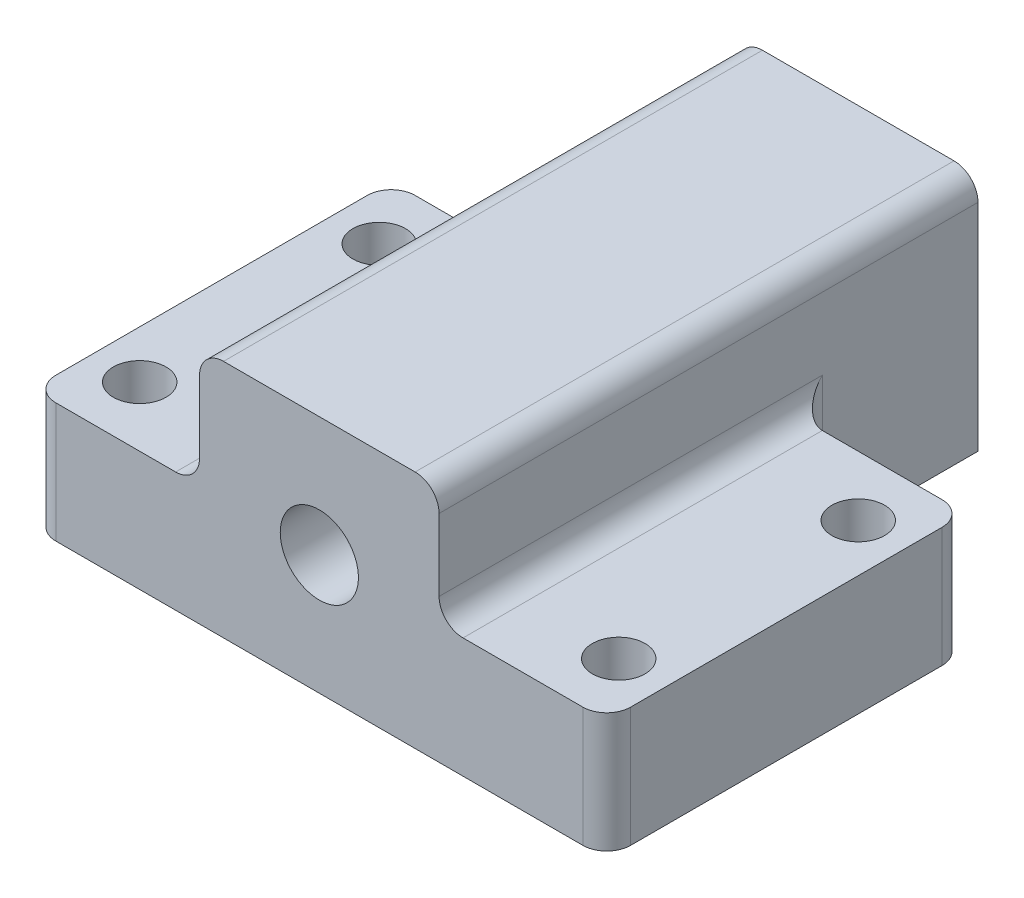
ISO-10303-21;
HEADER;
FILE_DESCRIPTION(('STEP AP214'),'2;1');
FILE_NAME('part.step','',(''),(''),'','','');
FILE_SCHEMA(('AUTOMOTIVE_DESIGN { 1 0 10303 214 1 1 1 1 }'));
ENDSEC;
DATA;
#1=APPLICATION_CONTEXT('core data for automotive mechanical design processes');
#2=APPLICATION_PROTOCOL_DEFINITION('international standard','automotive_design',2000,#1);
#3=PRODUCT_CONTEXT('',#1,'mechanical');
#4=PRODUCT('Part','Part','',(#3));
#5=PRODUCT_RELATED_PRODUCT_CATEGORY('part','',(#4));
#6=PRODUCT_DEFINITION_FORMATION('','',#4);
#7=PRODUCT_DEFINITION_CONTEXT('part definition',#1,'design');
#8=PRODUCT_DEFINITION('design','',#6,#7);
#9=PRODUCT_DEFINITION_SHAPE('','',#8);
#10=(LENGTH_UNIT() NAMED_UNIT(*) SI_UNIT(.MILLI.,.METRE.));
#11=(NAMED_UNIT(*) PLANE_ANGLE_UNIT() SI_UNIT($,.RADIAN.));
#12=(NAMED_UNIT(*) SI_UNIT($,.STERADIAN.) SOLID_ANGLE_UNIT());
#13=UNCERTAINTY_MEASURE_WITH_UNIT(LENGTH_MEASURE(1.E-05),#10,'distance_accuracy_value','');
#14=(GEOMETRIC_REPRESENTATION_CONTEXT(3) GLOBAL_UNCERTAINTY_ASSIGNED_CONTEXT((#13)) GLOBAL_UNIT_ASSIGNED_CONTEXT((#10,
#11,#12)) REPRESENTATION_CONTEXT('',''));
#15=CARTESIAN_POINT('',(0.,0.,0.));
#16=DIRECTION('',(0.,0.,1.));
#17=DIRECTION('',(1.,0.,0.));
#18=AXIS2_PLACEMENT_3D('',#15,#16,#17);
#19=CARTESIAN_POINT('',(0.,10.,0.));
#20=DIRECTION('',(0.,-1.,0.));
#21=DIRECTION('',(0.,0.,-1.));
#22=AXIS2_PLACEMENT_3D('',#19,#20,#21);
#23=PLANE('',#22);
#24=CARTESIAN_POINT('',(20.,10.,10.));
#25=DIRECTION('',(0.,1.,0.));
#26=DIRECTION('',(0.,0.,1.));
#27=AXIS2_PLACEMENT_3D('',#24,#25,#26);
#28=CIRCLE('',#27,2.2);
#29=CARTESIAN_POINT('',(20.,10.,12.2));
#30=VERTEX_POINT('',#29);
#31=EDGE_CURVE('E282',#30,#30,#28,.T.);
#32=ORIENTED_EDGE('',*,*,#31,.F.);
#33=EDGE_LOOP('',(#32));
#34=FACE_BOUND('',#33,.T.);
#35=CARTESIAN_POINT('',(20.,10.,-10.));
#36=DIRECTION('',(0.,1.,0.));
#37=DIRECTION('',(0.,0.,1.));
#38=AXIS2_PLACEMENT_3D('',#35,#36,#37);
#39=CIRCLE('',#38,2.2);
#40=CARTESIAN_POINT('',(20.,10.,-7.8));
#41=VERTEX_POINT('',#40);
#42=EDGE_CURVE('E294',#41,#41,#39,.T.);
#43=ORIENTED_EDGE('',*,*,#42,.F.);
#44=EDGE_LOOP('',(#43));
#45=FACE_BOUND('',#44,.T.);
#46=DIRECTION('',(1.,0.,0.));
#47=VECTOR('',#46,1.);
#48=CARTESIAN_POINT('',(-24.,10.,15.));
#49=LINE('',#48,#47);
#50=CARTESIAN_POINT('',(12.,10.,15.));
#51=VERTEX_POINT('',#50);
#52=CARTESIAN_POINT('',(22.,10.,15.));
#53=VERTEX_POINT('',#52);
#54=EDGE_CURVE('E303',#51,#53,#49,.T.);
#55=ORIENTED_EDGE('',*,*,#54,.T.);
#56=CARTESIAN_POINT('',(22.,10.,13.));
#57=DIRECTION('',(0.,-1.,0.));
#58=DIRECTION('',(0.,0.,-1.));
#59=AXIS2_PLACEMENT_3D('',#56,#57,#58);
#60=CIRCLE('',#59,2.);
#61=CARTESIAN_POINT('',(24.,10.,13.));
#62=VERTEX_POINT('',#61);
#63=EDGE_CURVE('E391',#53,#62,#60,.F.);
#64=ORIENTED_EDGE('',*,*,#63,.T.);
#65=DIRECTION('',(0.,0.,-1.));
#66=VECTOR('',#65,1.);
#67=CARTESIAN_POINT('',(24.,10.,15.));
#68=LINE('',#67,#66);
#69=CARTESIAN_POINT('',(24.,10.,-13.));
#70=VERTEX_POINT('',#69);
#71=EDGE_CURVE('E308',#62,#70,#68,.T.);
#72=ORIENTED_EDGE('',*,*,#71,.T.);
#73=CARTESIAN_POINT('',(22.,10.,-13.));
#74=DIRECTION('',(0.,-1.,0.));
#75=DIRECTION('',(0.,0.,-1.));
#76=AXIS2_PLACEMENT_3D('',#73,#74,#75);
#77=CIRCLE('',#76,2.);
#78=CARTESIAN_POINT('',(22.,10.,-15.));
#79=VERTEX_POINT('',#78);
#80=EDGE_CURVE('E389',#70,#79,#77,.F.);
#81=ORIENTED_EDGE('',*,*,#80,.T.);
#82=DIRECTION('',(-1.,0.,0.));
#83=VECTOR('',#82,1.);
#84=CARTESIAN_POINT('',(-24.,10.,-15.));
#85=LINE('',#84,#83);
#86=CARTESIAN_POINT('',(12.,10.,-15.));
#87=VERTEX_POINT('',#86);
#88=EDGE_CURVE('E312',#79,#87,#85,.T.);
#89=ORIENTED_EDGE('',*,*,#88,.T.);
#90=DIRECTION('',(0.,0.,-1.));
#91=VECTOR('',#90,1.);
#92=CARTESIAN_POINT('',(12.,10.,15.));
#93=LINE('',#92,#91);
#94=EDGE_CURVE('E387',#87,#51,#93,.F.);
#95=ORIENTED_EDGE('',*,*,#94,.T.);
#96=EDGE_LOOP('',(#55,#64,#72,#81,#89,#95));
#97=FACE_BOUND('',#96,.T.);
#98=ADVANCED_FACE('F33',(#34,#45,#97),#23,.F.);
#99=CARTESIAN_POINT('',(-20.,10.,10.));
#100=DIRECTION('',(0.,1.,0.));
#101=DIRECTION('',(0.,0.,1.));
#102=AXIS2_PLACEMENT_3D('',#99,#100,#101);
#103=CIRCLE('',#102,2.2);
#104=CARTESIAN_POINT('',(-20.,10.,12.2));
#105=VERTEX_POINT('',#104);
#106=EDGE_CURVE('E276',#105,#105,#103,.T.);
#107=ORIENTED_EDGE('',*,*,#106,.F.);
#108=EDGE_LOOP('',(#107));
#109=FACE_BOUND('',#108,.T.);
#110=CARTESIAN_POINT('',(-20.,10.,-10.));
#111=DIRECTION('',(0.,1.,0.));
#112=DIRECTION('',(0.,0.,1.));
#113=AXIS2_PLACEMENT_3D('',#110,#111,#112);
#114=CIRCLE('',#113,2.2);
#115=CARTESIAN_POINT('',(-20.,10.,-7.8));
#116=VERTEX_POINT('',#115);
#117=EDGE_CURVE('E288',#116,#116,#114,.T.);
#118=ORIENTED_EDGE('',*,*,#117,.F.);
#119=EDGE_LOOP('',(#118));
#120=FACE_BOUND('',#119,.T.);
#121=DIRECTION('',(0.,0.,1.));
#122=VECTOR('',#121,1.);
#123=CARTESIAN_POINT('',(-24.,10.,15.));
#124=LINE('',#123,#122);
#125=CARTESIAN_POINT('',(-24.,10.,-13.));
#126=VERTEX_POINT('',#125);
#127=CARTESIAN_POINT('',(-24.,10.,13.));
#128=VERTEX_POINT('',#127);
#129=EDGE_CURVE('E300',#126,#128,#124,.T.);
#130=ORIENTED_EDGE('',*,*,#129,.T.);
#131=CARTESIAN_POINT('',(-22.,10.,13.));
#132=DIRECTION('',(0.,-1.,0.));
#133=DIRECTION('',(0.,0.,-1.));
#134=AXIS2_PLACEMENT_3D('',#131,#132,#133);
#135=CIRCLE('',#134,2.);
#136=CARTESIAN_POINT('',(-22.,10.,15.));
#137=VERTEX_POINT('',#136);
#138=EDGE_CURVE('E380',#128,#137,#135,.F.);
#139=ORIENTED_EDGE('',*,*,#138,.T.);
#140=CARTESIAN_POINT('',(-12.,10.,15.));
#141=VERTEX_POINT('',#140);
#142=EDGE_CURVE('E305',#137,#141,#49,.T.);
#143=ORIENTED_EDGE('',*,*,#142,.T.);
#144=DIRECTION('',(0.,0.,1.));
#145=VECTOR('',#144,1.);
#146=CARTESIAN_POINT('',(-12.,10.,-15.));
#147=LINE('',#146,#145);
#148=CARTESIAN_POINT('',(-12.,10.,-15.));
#149=VERTEX_POINT('',#148);
#150=EDGE_CURVE('E376',#141,#149,#147,.F.);
#151=ORIENTED_EDGE('',*,*,#150,.T.);
#152=CARTESIAN_POINT('',(-22.,10.,-15.));
#153=VERTEX_POINT('',#152);
#154=EDGE_CURVE('E311',#149,#153,#85,.T.);
#155=ORIENTED_EDGE('',*,*,#154,.T.);
#156=CARTESIAN_POINT('',(-22.,10.,-13.));
#157=DIRECTION('',(0.,-1.,0.));
#158=DIRECTION('',(0.,0.,-1.));
#159=AXIS2_PLACEMENT_3D('',#156,#157,#158);
#160=CIRCLE('',#159,2.);
#161=EDGE_CURVE('E378',#153,#126,#160,.F.);
#162=ORIENTED_EDGE('',*,*,#161,.T.);
#163=EDGE_LOOP('',(#130,#139,#143,#151,#155,#162));
#164=FACE_BOUND('',#163,.T.);
#165=ADVANCED_FACE('F476',(#109,#120,#164),#23,.F.);
#166=CARTESIAN_POINT('',(-24.,10.,-15.));
#167=DIRECTION('',(0.,0.,1.));
#168=DIRECTION('',(1.,0.,0.));
#169=AXIS2_PLACEMENT_3D('',#166,#167,#168);
#170=PLANE('',#169);
#171=DIRECTION('',(-1.,0.,0.));
#172=VECTOR('',#171,1.);
#173=CARTESIAN_POINT('',(-24.,0.,-15.));
#174=LINE('',#173,#172);
#175=CARTESIAN_POINT('',(22.,0.,-15.));
#176=VERTEX_POINT('',#175);
#177=CARTESIAN_POINT('',(12.,0.,-15.));
#178=VERTEX_POINT('',#177);
#179=EDGE_CURVE('E304',#176,#178,#174,.T.);
#180=ORIENTED_EDGE('',*,*,#179,.T.);
#181=DIRECTION('',(0.,-1.,0.));
#182=VECTOR('',#181,1.);
#183=CARTESIAN_POINT('',(12.,10.,-15.));
#184=LINE('',#183,#182);
#185=EDGE_CURVE('E352',#178,#87,#184,.F.);
#186=ORIENTED_EDGE('',*,*,#185,.T.);
#187=ORIENTED_EDGE('',*,*,#88,.F.);
#188=DIRECTION('',(0.,-1.,0.));
#189=VECTOR('',#188,1.);
#190=CARTESIAN_POINT('',(22.,10.,-15.));
#191=LINE('',#190,#189);
#192=EDGE_CURVE('E349',#79,#176,#191,.T.);
#193=ORIENTED_EDGE('',*,*,#192,.T.);
#194=EDGE_LOOP('',(#180,#186,#187,#193));
#195=FACE_BOUND('',#194,.T.);
#196=ADVANCED_FACE('F447',(#195),#170,.F.);
#197=ORIENTED_EDGE('',*,*,#154,.F.);
#198=DIRECTION('',(0.,1.,0.));
#199=VECTOR('',#198,1.);
#200=CARTESIAN_POINT('',(-12.,0.,-15.));
#201=LINE('',#200,#199);
#202=CARTESIAN_POINT('',(-12.,0.,-15.));
#203=VERTEX_POINT('',#202);
#204=EDGE_CURVE('E339',#149,#203,#201,.F.);
#205=ORIENTED_EDGE('',*,*,#204,.T.);
#206=CARTESIAN_POINT('',(-22.,0.,-15.));
#207=VERTEX_POINT('',#206);
#208=EDGE_CURVE('E324',#203,#207,#174,.T.);
#209=ORIENTED_EDGE('',*,*,#208,.T.);
#210=DIRECTION('',(0.,-1.,0.));
#211=VECTOR('',#210,1.);
#212=CARTESIAN_POINT('',(-22.,10.,-15.));
#213=LINE('',#212,#211);
#214=EDGE_CURVE('E337',#207,#153,#213,.F.);
#215=ORIENTED_EDGE('',*,*,#214,.T.);
#216=EDGE_LOOP('',(#197,#205,#209,#215));
#217=FACE_BOUND('',#216,.T.);
#218=ADVANCED_FACE('F496',(#217),#170,.F.);
#219=CARTESIAN_POINT('',(0.,0.,0.));
#220=DIRECTION('',(0.,-1.,0.));
#221=DIRECTION('',(0.,0.,-1.));
#222=AXIS2_PLACEMENT_3D('',#219,#220,#221);
#223=PLANE('',#222);
#224=DIRECTION('',(1.,0.,0.));
#225=VECTOR('',#224,1.);
#226=CARTESIAN_POINT('',(-24.,0.,15.));
#227=LINE('',#226,#225);
#228=CARTESIAN_POINT('',(-22.,0.,15.));
#229=VERTEX_POINT('',#228);
#230=CARTESIAN_POINT('',(22.,0.,15.));
#231=VERTEX_POINT('',#230);
#232=EDGE_CURVE('E318',#229,#231,#227,.T.);
#233=ORIENTED_EDGE('',*,*,#232,.F.);
#234=CARTESIAN_POINT('',(-22.,0.,13.));
#235=DIRECTION('',(0.,-1.,0.));
#236=DIRECTION('',(0.,0.,-1.));
#237=AXIS2_PLACEMENT_3D('',#234,#235,#236);
#238=CIRCLE('',#237,2.);
#239=CARTESIAN_POINT('',(-24.,0.,13.));
#240=VERTEX_POINT('',#239);
#241=EDGE_CURVE('E369',#229,#240,#238,.T.);
#242=ORIENTED_EDGE('',*,*,#241,.T.);
#243=DIRECTION('',(0.,0.,1.));
#244=VECTOR('',#243,1.);
#245=CARTESIAN_POINT('',(-24.,0.,15.));
#246=LINE('',#245,#244);
#247=CARTESIAN_POINT('',(-24.,0.,-13.));
#248=VERTEX_POINT('',#247);
#249=EDGE_CURVE('E297',#248,#240,#246,.T.);
#250=ORIENTED_EDGE('',*,*,#249,.F.);
#251=CARTESIAN_POINT('',(-22.,0.,-13.));
#252=DIRECTION('',(0.,-1.,0.));
#253=DIRECTION('',(0.,0.,-1.));
#254=AXIS2_PLACEMENT_3D('',#251,#252,#253);
#255=CIRCLE('',#254,2.);
#256=EDGE_CURVE('E367',#248,#207,#255,.T.);
#257=ORIENTED_EDGE('',*,*,#256,.T.);
#258=ORIENTED_EDGE('',*,*,#208,.F.);
#259=CARTESIAN_POINT('',(-12.,0.,-17.));
#260=DIRECTION('',(0.,-1.,0.));
#261=DIRECTION('',(0.,0.,-1.));
#262=AXIS2_PLACEMENT_3D('',#259,#260,#261);
#263=CIRCLE('',#262,2.);
#264=CARTESIAN_POINT('',(-10.,0.,-17.));
#265=VERTEX_POINT('',#264);
#266=EDGE_CURVE('E400',#203,#265,#263,.F.);
#267=ORIENTED_EDGE('',*,*,#266,.T.);
#268=DIRECTION('',(0.,0.,1.));
#269=VECTOR('',#268,1.);
#270=CARTESIAN_POINT('',(-10.,0.,-30.));
#271=LINE('',#270,#269);
#272=CARTESIAN_POINT('',(-10.,0.,-30.));
#273=VERTEX_POINT('',#272);
#274=EDGE_CURVE('E269',#273,#265,#271,.T.);
#275=ORIENTED_EDGE('',*,*,#274,.F.);
#276=DIRECTION('',(-1.,0.,0.));
#277=VECTOR('',#276,1.);
#278=CARTESIAN_POINT('',(10.,0.,-30.));
#279=LINE('',#278,#277);
#280=CARTESIAN_POINT('',(10.,0.,-30.));
#281=VERTEX_POINT('',#280);
#282=EDGE_CURVE('E263',#281,#273,#279,.T.);
#283=ORIENTED_EDGE('',*,*,#282,.F.);
#284=DIRECTION('',(0.,0.,1.));
#285=VECTOR('',#284,1.);
#286=CARTESIAN_POINT('',(10.,0.,-30.));
#287=LINE('',#286,#285);
#288=CARTESIAN_POINT('',(10.,0.,-17.));
#289=VERTEX_POINT('',#288);
#290=EDGE_CURVE('E272',#281,#289,#287,.T.);
#291=ORIENTED_EDGE('',*,*,#290,.T.);
#292=CARTESIAN_POINT('',(12.,0.,-17.));
#293=DIRECTION('',(0.,-1.,0.));
#294=DIRECTION('',(0.,0.,-1.));
#295=AXIS2_PLACEMENT_3D('',#292,#293,#294);
#296=CIRCLE('',#295,2.);
#297=EDGE_CURVE('E402',#289,#178,#296,.F.);
#298=ORIENTED_EDGE('',*,*,#297,.T.);
#299=ORIENTED_EDGE('',*,*,#179,.F.);
#300=CARTESIAN_POINT('',(22.,0.,-13.));
#301=DIRECTION('',(0.,-1.,0.));
#302=DIRECTION('',(0.,0.,-1.));
#303=AXIS2_PLACEMENT_3D('',#300,#301,#302);
#304=CIRCLE('',#303,2.);
#305=CARTESIAN_POINT('',(24.,0.,-13.));
#306=VERTEX_POINT('',#305);
#307=EDGE_CURVE('E363',#176,#306,#304,.T.);
#308=ORIENTED_EDGE('',*,*,#307,.T.);
#309=DIRECTION('',(0.,0.,-1.));
#310=VECTOR('',#309,1.);
#311=CARTESIAN_POINT('',(24.,0.,15.));
#312=LINE('',#311,#310);
#313=CARTESIAN_POINT('',(24.,0.,13.));
#314=VERTEX_POINT('',#313);
#315=EDGE_CURVE('E321',#314,#306,#312,.T.);
#316=ORIENTED_EDGE('',*,*,#315,.F.);
#317=CARTESIAN_POINT('',(22.,0.,13.));
#318=DIRECTION('',(0.,-1.,0.));
#319=DIRECTION('',(0.,0.,-1.));
#320=AXIS2_PLACEMENT_3D('',#317,#318,#319);
#321=CIRCLE('',#320,2.);
#322=EDGE_CURVE('E365',#314,#231,#321,.T.);
#323=ORIENTED_EDGE('',*,*,#322,.T.);
#324=EDGE_LOOP('',(#233,#242,#250,#257,#258,#267,#275,#283,#291,#298,#299,#308,#316,#323));
#325=FACE_BOUND('',#324,.T.);
#326=CARTESIAN_POINT('',(-20.,0.,10.));
#327=DIRECTION('',(0.,1.,0.));
#328=DIRECTION('',(0.,0.,1.));
#329=AXIS2_PLACEMENT_3D('',#326,#327,#328);
#330=CIRCLE('',#329,2.2);
#331=CARTESIAN_POINT('',(-20.,0.,12.2));
#332=VERTEX_POINT('',#331);
#333=EDGE_CURVE('E275',#332,#332,#330,.T.);
#334=ORIENTED_EDGE('',*,*,#333,.T.);
#335=EDGE_LOOP('',(#334));
#336=FACE_BOUND('',#335,.T.);
#337=CARTESIAN_POINT('',(-20.,0.,-10.));
#338=DIRECTION('',(0.,1.,0.));
#339=DIRECTION('',(0.,0.,1.));
#340=AXIS2_PLACEMENT_3D('',#337,#338,#339);
#341=CIRCLE('',#340,2.2);
#342=CARTESIAN_POINT('',(-20.,0.,-7.8));
#343=VERTEX_POINT('',#342);
#344=EDGE_CURVE('E285',#343,#343,#341,.T.);
#345=ORIENTED_EDGE('',*,*,#344,.T.);
#346=EDGE_LOOP('',(#345));
#347=FACE_BOUND('',#346,.T.);
#348=CARTESIAN_POINT('',(20.,0.,10.));
#349=DIRECTION('',(0.,1.,0.));
#350=DIRECTION('',(0.,0.,1.));
#351=AXIS2_PLACEMENT_3D('',#348,#349,#350);
#352=CIRCLE('',#351,2.2);
#353=CARTESIAN_POINT('',(20.,0.,12.2));
#354=VERTEX_POINT('',#353);
#355=EDGE_CURVE('E279',#354,#354,#352,.T.);
#356=ORIENTED_EDGE('',*,*,#355,.T.);
#357=EDGE_LOOP('',(#356));
#358=FACE_BOUND('',#357,.T.);
#359=CARTESIAN_POINT('',(20.,0.,-10.));
#360=DIRECTION('',(0.,1.,0.));
#361=DIRECTION('',(0.,0.,1.));
#362=AXIS2_PLACEMENT_3D('',#359,#360,#361);
#363=CIRCLE('',#362,2.2);
#364=CARTESIAN_POINT('',(20.,0.,-7.8));
#365=VERTEX_POINT('',#364);
#366=EDGE_CURVE('E291',#365,#365,#363,.T.);
#367=ORIENTED_EDGE('',*,*,#366,.T.);
#368=EDGE_LOOP('',(#367));
#369=FACE_BOUND('',#368,.T.);
#370=ADVANCED_FACE('F450',(#325,#336,#347,#358,#369),#223,.T.);
#371=CARTESIAN_POINT('',(-24.,10.,15.));
#372=DIRECTION('',(1.,0.,0.));
#373=DIRECTION('',(0.,0.,-1.));
#374=AXIS2_PLACEMENT_3D('',#371,#372,#373);
#375=PLANE('',#374);
#376=ORIENTED_EDGE('',*,*,#249,.T.);
#377=DIRECTION('',(0.,-1.,0.));
#378=VECTOR('',#377,1.);
#379=CARTESIAN_POINT('',(-24.,10.,13.));
#380=LINE('',#379,#378);
#381=EDGE_CURVE('E374',#240,#128,#380,.F.);
#382=ORIENTED_EDGE('',*,*,#381,.T.);
#383=ORIENTED_EDGE('',*,*,#129,.F.);
#384=DIRECTION('',(0.,-1.,0.));
#385=VECTOR('',#384,1.);
#386=CARTESIAN_POINT('',(-24.,10.,-13.));
#387=LINE('',#386,#385);
#388=EDGE_CURVE('E371',#126,#248,#387,.T.);
#389=ORIENTED_EDGE('',*,*,#388,.T.);
#390=EDGE_LOOP('',(#376,#382,#383,#389));
#391=FACE_BOUND('',#390,.T.);
#392=ADVANCED_FACE('F486',(#391),#375,.F.);
#393=CARTESIAN_POINT('',(-24.,10.,15.));
#394=DIRECTION('',(0.,0.,-1.));
#395=DIRECTION('',(-1.,0.,0.));
#396=AXIS2_PLACEMENT_3D('',#393,#394,#395);
#397=PLANE('',#396);
#398=CARTESIAN_POINT('',(0.,10.,15.));
#399=DIRECTION('',(0.,0.,-1.));
#400=DIRECTION('',(-1.,0.,0.));
#401=AXIS2_PLACEMENT_3D('',#398,#399,#400);
#402=CIRCLE('',#401,3.2639);
#403=CARTESIAN_POINT('',(-3.2639,10.,15.));
#404=VERTEX_POINT('',#403);
#405=EDGE_CURVE('E330',#404,#404,#402,.T.);
#406=ORIENTED_EDGE('',*,*,#405,.T.);
#407=EDGE_LOOP('',(#406));
#408=FACE_BOUND('',#407,.T.);
#409=ORIENTED_EDGE('',*,*,#142,.F.);
#410=DIRECTION('',(0.,-1.,0.));
#411=VECTOR('',#410,1.);
#412=CARTESIAN_POINT('',(-22.,10.,15.));
#413=LINE('',#412,#411);
#414=EDGE_CURVE('E360',#137,#229,#413,.T.);
#415=ORIENTED_EDGE('',*,*,#414,.T.);
#416=ORIENTED_EDGE('',*,*,#232,.T.);
#417=DIRECTION('',(0.,-1.,0.));
#418=VECTOR('',#417,1.);
#419=CARTESIAN_POINT('',(22.,10.,15.));
#420=LINE('',#419,#418);
#421=EDGE_CURVE('E358',#231,#53,#420,.F.);
#422=ORIENTED_EDGE('',*,*,#421,.T.);
#423=ORIENTED_EDGE('',*,*,#54,.F.);
#424=CARTESIAN_POINT('',(12.,12.,15.));
#425=DIRECTION('',(0.,0.,-1.));
#426=DIRECTION('',(-1.,0.,0.));
#427=AXIS2_PLACEMENT_3D('',#424,#425,#426);
#428=CIRCLE('',#427,2.);
#429=CARTESIAN_POINT('',(10.,12.,15.));
#430=VERTEX_POINT('',#429);
#431=EDGE_CURVE('E11',#51,#430,#428,.T.);
#432=ORIENTED_EDGE('',*,*,#431,.T.);
#433=DIRECTION('',(0.,1.,0.));
#434=VECTOR('',#433,1.);
#435=CARTESIAN_POINT('',(10.,0.,15.));
#436=LINE('',#435,#434);
#437=CARTESIAN_POINT('',(10.,18.,15.));
#438=VERTEX_POINT('',#437);
#439=EDGE_CURVE('E258',#430,#438,#436,.T.);
#440=ORIENTED_EDGE('',*,*,#439,.T.);
#441=CARTESIAN_POINT('',(8.,18.,15.));
#442=DIRECTION('',(0.,0.,-1.));
#443=DIRECTION('',(-1.,0.,0.));
#444=AXIS2_PLACEMENT_3D('',#441,#442,#443);
#445=CIRCLE('',#444,2.);
#446=CARTESIAN_POINT('',(8.,20.,15.));
#447=VERTEX_POINT('',#446);
#448=EDGE_CURVE('E354',#438,#447,#445,.F.);
#449=ORIENTED_EDGE('',*,*,#448,.T.);
#450=DIRECTION('',(-1.,0.,0.));
#451=VECTOR('',#450,1.);
#452=CARTESIAN_POINT('',(10.,20.,15.));
#453=LINE('',#452,#451);
#454=CARTESIAN_POINT('',(-8.,20.,15.));
#455=VERTEX_POINT('',#454);
#456=EDGE_CURVE('E255',#447,#455,#453,.T.);
#457=ORIENTED_EDGE('',*,*,#456,.T.);
#458=CARTESIAN_POINT('',(-8.,18.,15.));
#459=DIRECTION('',(0.,0.,-1.));
#460=DIRECTION('',(-1.,0.,0.));
#461=AXIS2_PLACEMENT_3D('',#458,#459,#460);
#462=CIRCLE('',#461,2.);
#463=CARTESIAN_POINT('',(-10.,18.,15.));
#464=VERTEX_POINT('',#463);
#465=EDGE_CURVE('E356',#455,#464,#462,.F.);
#466=ORIENTED_EDGE('',*,*,#465,.T.);
#467=DIRECTION('',(0.,-1.,0.));
#468=VECTOR('',#467,1.);
#469=CARTESIAN_POINT('',(-10.,0.,15.));
#470=LINE('',#469,#468);
#471=CARTESIAN_POINT('',(-10.,12.,15.));
#472=VERTEX_POINT('',#471);
#473=EDGE_CURVE('E252',#464,#472,#470,.T.);
#474=ORIENTED_EDGE('',*,*,#473,.T.);
#475=CARTESIAN_POINT('',(-12.,12.,15.));
#476=DIRECTION('',(0.,0.,-1.));
#477=DIRECTION('',(-1.,0.,0.));
#478=AXIS2_PLACEMENT_3D('',#475,#476,#477);
#479=CIRCLE('',#478,2.);
#480=EDGE_CURVE('E42',#472,#141,#479,.T.);
#481=ORIENTED_EDGE('',*,*,#480,.T.);
#482=EDGE_LOOP('',(#409,#415,#416,#422,#423,#432,#440,#449,#457,#466,#474,#481));
#483=FACE_BOUND('',#482,.T.);
#484=ADVANCED_FACE('F430',(#408,#483),#397,.F.);
#485=CARTESIAN_POINT('',(24.,10.,15.));
#486=DIRECTION('',(-1.,0.,0.));
#487=DIRECTION('',(0.,0.,1.));
#488=AXIS2_PLACEMENT_3D('',#485,#486,#487);
#489=PLANE('',#488);
#490=ORIENTED_EDGE('',*,*,#71,.F.);
#491=DIRECTION('',(0.,-1.,0.));
#492=VECTOR('',#491,1.);
#493=CARTESIAN_POINT('',(24.,10.,13.));
#494=LINE('',#493,#492);
#495=EDGE_CURVE('E384',#62,#314,#494,.T.);
#496=ORIENTED_EDGE('',*,*,#495,.T.);
#497=ORIENTED_EDGE('',*,*,#315,.T.);
#498=DIRECTION('',(0.,-1.,0.));
#499=VECTOR('',#498,1.);
#500=CARTESIAN_POINT('',(24.,10.,-13.));
#501=LINE('',#500,#499);
#502=EDGE_CURVE('E382',#306,#70,#501,.F.);
#503=ORIENTED_EDGE('',*,*,#502,.T.);
#504=EDGE_LOOP('',(#490,#496,#497,#503));
#505=FACE_BOUND('',#504,.T.);
#506=ADVANCED_FACE('F440',(#505),#489,.F.);
#507=CARTESIAN_POINT('',(20.,10.,-10.));
#508=DIRECTION('',(0.,-1.,0.));
#509=DIRECTION('',(0.,0.,-1.));
#510=AXIS2_PLACEMENT_3D('',#507,#508,#509);
#511=CYLINDRICAL_SURFACE('',#510,2.2);
#512=ORIENTED_EDGE('',*,*,#42,.T.);
#513=EDGE_LOOP('',(#512));
#514=FACE_BOUND('',#513,.T.);
#515=ORIENTED_EDGE('',*,*,#366,.F.);
#516=EDGE_LOOP('',(#515));
#517=FACE_BOUND('',#516,.T.);
#518=ADVANCED_FACE('F520',(#514,#517),#511,.F.);
#519=CARTESIAN_POINT('',(-20.,10.,-10.));
#520=DIRECTION('',(0.,-1.,0.));
#521=DIRECTION('',(0.,0.,-1.));
#522=AXIS2_PLACEMENT_3D('',#519,#520,#521);
#523=CYLINDRICAL_SURFACE('',#522,2.2);
#524=ORIENTED_EDGE('',*,*,#117,.T.);
#525=EDGE_LOOP('',(#524));
#526=FACE_BOUND('',#525,.T.);
#527=ORIENTED_EDGE('',*,*,#344,.F.);
#528=EDGE_LOOP('',(#527));
#529=FACE_BOUND('',#528,.T.);
#530=ADVANCED_FACE('F551',(#526,#529),#523,.F.);
#531=CARTESIAN_POINT('',(20.,10.,10.));
#532=DIRECTION('',(0.,-1.,0.));
#533=DIRECTION('',(0.,0.,-1.));
#534=AXIS2_PLACEMENT_3D('',#531,#532,#533);
#535=CYLINDRICAL_SURFACE('',#534,2.2);
#536=ORIENTED_EDGE('',*,*,#31,.T.);
#537=EDGE_LOOP('',(#536));
#538=FACE_BOUND('',#537,.T.);
#539=ORIENTED_EDGE('',*,*,#355,.F.);
#540=EDGE_LOOP('',(#539));
#541=FACE_BOUND('',#540,.T.);
#542=ADVANCED_FACE('F558',(#538,#541),#535,.F.);
#543=CARTESIAN_POINT('',(-20.,10.,10.));
#544=DIRECTION('',(0.,-1.,0.));
#545=DIRECTION('',(0.,0.,-1.));
#546=AXIS2_PLACEMENT_3D('',#543,#544,#545);
#547=CYLINDRICAL_SURFACE('',#546,2.2);
#548=ORIENTED_EDGE('',*,*,#106,.T.);
#549=EDGE_LOOP('',(#548));
#550=FACE_BOUND('',#549,.T.);
#551=ORIENTED_EDGE('',*,*,#333,.F.);
#552=EDGE_LOOP('',(#551));
#553=FACE_BOUND('',#552,.T.);
#554=ADVANCED_FACE('F565',(#550,#553),#547,.F.);
#555=CARTESIAN_POINT('',(10.,0.,-30.));
#556=DIRECTION('',(-1.,0.,0.));
#557=DIRECTION('',(0.,0.,1.));
#558=AXIS2_PLACEMENT_3D('',#555,#556,#557);
#559=PLANE('',#558);
#560=DIRECTION('',(0.,-1.,0.));
#561=VECTOR('',#560,1.);
#562=CARTESIAN_POINT('',(10.,0.,-30.));
#563=LINE('',#562,#561);
#564=CARTESIAN_POINT('',(10.,18.,-30.));
#565=VERTEX_POINT('',#564);
#566=EDGE_CURVE('E261',#565,#281,#563,.T.);
#567=ORIENTED_EDGE('',*,*,#566,.F.);
#568=DIRECTION('',(0.,0.,1.));
#569=VECTOR('',#568,1.);
#570=CARTESIAN_POINT('',(10.,18.,-30.));
#571=LINE('',#570,#569);
#572=EDGE_CURVE('E346',#565,#438,#571,.T.);
#573=ORIENTED_EDGE('',*,*,#572,.T.);
#574=ORIENTED_EDGE('',*,*,#439,.F.);
#575=DIRECTION('',(0.,0.,-1.));
#576=VECTOR('',#575,1.);
#577=CARTESIAN_POINT('',(10.,12.,-15.));
#578=LINE('',#577,#576);
#579=CARTESIAN_POINT('',(10.,12.,-17.));
#580=VERTEX_POINT('',#579);
#581=EDGE_CURVE('E341',#430,#580,#578,.T.);
#582=ORIENTED_EDGE('',*,*,#581,.T.);
#583=DIRECTION('',(0.,-1.,0.));
#584=VECTOR('',#583,1.);
#585=CARTESIAN_POINT('',(10.,0.,-17.));
#586=LINE('',#585,#584);
#587=EDGE_CURVE('E343',#580,#289,#586,.T.);
#588=ORIENTED_EDGE('',*,*,#587,.T.);
#589=ORIENTED_EDGE('',*,*,#290,.F.);
#590=EDGE_LOOP('',(#567,#573,#574,#582,#588,#589));
#591=FACE_BOUND('',#590,.T.);
#592=ADVANCED_FACE('F456',(#591),#559,.F.);
#593=CARTESIAN_POINT('',(-10.,0.,-30.));
#594=DIRECTION('',(1.,0.,0.));
#595=DIRECTION('',(0.,0.,-1.));
#596=AXIS2_PLACEMENT_3D('',#593,#594,#595);
#597=PLANE('',#596);
#598=ORIENTED_EDGE('',*,*,#274,.T.);
#599=DIRECTION('',(0.,1.,0.));
#600=VECTOR('',#599,1.);
#601=CARTESIAN_POINT('',(-10.,10.,-17.));
#602=LINE('',#601,#600);
#603=CARTESIAN_POINT('',(-10.,12.,-17.));
#604=VERTEX_POINT('',#603);
#605=EDGE_CURVE('E334',#265,#604,#602,.T.);
#606=ORIENTED_EDGE('',*,*,#605,.T.);
#607=DIRECTION('',(0.,0.,1.));
#608=VECTOR('',#607,1.);
#609=CARTESIAN_POINT('',(-10.,12.,15.));
#610=LINE('',#609,#608);
#611=EDGE_CURVE('E332',#604,#472,#610,.T.);
#612=ORIENTED_EDGE('',*,*,#611,.T.);
#613=ORIENTED_EDGE('',*,*,#473,.F.);
#614=DIRECTION('',(0.,0.,1.));
#615=VECTOR('',#614,1.);
#616=CARTESIAN_POINT('',(-10.,18.,-30.));
#617=LINE('',#616,#615);
#618=CARTESIAN_POINT('',(-10.,18.,-30.));
#619=VERTEX_POINT('',#618);
#620=EDGE_CURVE('E315',#464,#619,#617,.F.);
#621=ORIENTED_EDGE('',*,*,#620,.T.);
#622=DIRECTION('',(0.,1.,0.));
#623=VECTOR('',#622,1.);
#624=CARTESIAN_POINT('',(-10.,0.,-30.));
#625=LINE('',#624,#623);
#626=EDGE_CURVE('E265',#273,#619,#625,.T.);
#627=ORIENTED_EDGE('',*,*,#626,.F.);
#628=EDGE_LOOP('',(#598,#606,#612,#613,#621,#627));
#629=FACE_BOUND('',#628,.T.);
#630=ADVANCED_FACE('F469',(#629),#597,.F.);
#631=CARTESIAN_POINT('',(10.,20.,-30.));
#632=DIRECTION('',(0.,-1.,0.));
#633=DIRECTION('',(0.,0.,-1.));
#634=AXIS2_PLACEMENT_3D('',#631,#632,#633);
#635=PLANE('',#634);
#636=DIRECTION('',(1.,0.,0.));
#637=VECTOR('',#636,1.);
#638=CARTESIAN_POINT('',(10.,20.,-30.));
#639=LINE('',#638,#637);
#640=CARTESIAN_POINT('',(-8.,20.,-30.));
#641=VERTEX_POINT('',#640);
#642=CARTESIAN_POINT('',(8.,20.,-30.));
#643=VERTEX_POINT('',#642);
#644=EDGE_CURVE('E267',#641,#643,#639,.T.);
#645=ORIENTED_EDGE('',*,*,#644,.F.);
#646=DIRECTION('',(0.,0.,1.));
#647=VECTOR('',#646,1.);
#648=CARTESIAN_POINT('',(-8.,20.,-30.));
#649=LINE('',#648,#647);
#650=EDGE_CURVE('E394',#641,#455,#649,.T.);
#651=ORIENTED_EDGE('',*,*,#650,.T.);
#652=ORIENTED_EDGE('',*,*,#456,.F.);
#653=DIRECTION('',(0.,0.,1.));
#654=VECTOR('',#653,1.);
#655=CARTESIAN_POINT('',(8.,20.,-30.));
#656=LINE('',#655,#654);
#657=EDGE_CURVE('E50',#447,#643,#656,.F.);
#658=ORIENTED_EDGE('',*,*,#657,.T.);
#659=EDGE_LOOP('',(#645,#651,#652,#658));
#660=FACE_BOUND('',#659,.T.);
#661=ADVANCED_FACE('F459',(#660),#635,.F.);
#662=CARTESIAN_POINT('',(0.,0.,-30.));
#663=DIRECTION('',(0.,0.,1.));
#664=DIRECTION('',(1.,0.,0.));
#665=AXIS2_PLACEMENT_3D('',#662,#663,#664);
#666=PLANE('',#665);
#667=DIRECTION('',(-0.866025403784439,-0.5,0.));
#668=VECTOR('',#667,1.);
#669=CARTESIAN_POINT('',(6.5,6.24722325026744,-30.));
#670=LINE('',#669,#668);
#671=CARTESIAN_POINT('',(6.5,6.24722325026744,-30.));
#672=VERTEX_POINT('',#671);
#673=CARTESIAN_POINT('',(0.,2.49444650053487,-30.));
#674=VERTEX_POINT('',#673);
#675=EDGE_CURVE('E806',#672,#674,#670,.T.);
#676=ORIENTED_EDGE('',*,*,#675,.F.);
#677=DIRECTION('',(0.,-1.,0.));
#678=VECTOR('',#677,1.);
#679=CARTESIAN_POINT('',(6.5,13.7527767497326,-30.));
#680=LINE('',#679,#678);
#681=CARTESIAN_POINT('',(6.5,13.7527767497326,-30.));
#682=VERTEX_POINT('',#681);
#683=EDGE_CURVE('E219',#682,#672,#680,.T.);
#684=ORIENTED_EDGE('',*,*,#683,.F.);
#685=DIRECTION('',(0.866025403784438,-0.5,0.));
#686=VECTOR('',#685,1.);
#687=CARTESIAN_POINT('',(0.,17.5055534994651,-30.));
#688=LINE('',#687,#686);
#689=CARTESIAN_POINT('',(0.,17.5055534994651,-30.));
#690=VERTEX_POINT('',#689);
#691=EDGE_CURVE('E232',#690,#682,#688,.T.);
#692=ORIENTED_EDGE('',*,*,#691,.F.);
#693=DIRECTION('',(0.866025403784438,0.5,0.));
#694=VECTOR('',#693,1.);
#695=CARTESIAN_POINT('',(-6.49999999999999,13.7527767497326,-30.));
#696=LINE('',#695,#694);
#697=CARTESIAN_POINT('',(-6.49999999999999,13.7527767497326,-30.));
#698=VERTEX_POINT('',#697);
#699=EDGE_CURVE('E226',#698,#690,#696,.T.);
#700=ORIENTED_EDGE('',*,*,#699,.F.);
#701=DIRECTION('',(0.,1.,0.));
#702=VECTOR('',#701,1.);
#703=CARTESIAN_POINT('',(-6.49999999999999,6.24722325026744,-30.));
#704=LINE('',#703,#702);
#705=CARTESIAN_POINT('',(-6.49999999999999,6.24722325026744,-30.));
#706=VERTEX_POINT('',#705);
#707=EDGE_CURVE('E228',#706,#698,#704,.T.);
#708=ORIENTED_EDGE('',*,*,#707,.F.);
#709=DIRECTION('',(-0.866025403784438,0.5,0.));
#710=VECTOR('',#709,1.);
#711=CARTESIAN_POINT('',(0.,2.49444650053487,-30.));
#712=LINE('',#711,#710);
#713=EDGE_CURVE('E807',#674,#706,#712,.T.);
#714=ORIENTED_EDGE('',*,*,#713,.F.);
#715=EDGE_LOOP('',(#676,#684,#692,#700,#708,#714));
#716=FACE_BOUND('',#715,.T.);
#717=ORIENTED_EDGE('',*,*,#626,.T.);
#718=CARTESIAN_POINT('',(-8.,18.,-30.));
#719=DIRECTION('',(0.,0.,1.));
#720=DIRECTION('',(1.,0.,0.));
#721=AXIS2_PLACEMENT_3D('',#718,#719,#720);
#722=CIRCLE('',#721,2.);
#723=EDGE_CURVE('E57',#619,#641,#722,.F.);
#724=ORIENTED_EDGE('',*,*,#723,.T.);
#725=ORIENTED_EDGE('',*,*,#644,.T.);
#726=CARTESIAN_POINT('',(8.,18.,-30.));
#727=DIRECTION('',(0.,0.,1.));
#728=DIRECTION('',(1.,0.,0.));
#729=AXIS2_PLACEMENT_3D('',#726,#727,#728);
#730=CIRCLE('',#729,2.);
#731=EDGE_CURVE('E397',#643,#565,#730,.F.);
#732=ORIENTED_EDGE('',*,*,#731,.T.);
#733=ORIENTED_EDGE('',*,*,#566,.T.);
#734=ORIENTED_EDGE('',*,*,#282,.T.);
#735=EDGE_LOOP('',(#717,#724,#725,#732,#733,#734));
#736=FACE_BOUND('',#735,.T.);
#737=ADVANCED_FACE('F462',(#716,#736),#666,.F.);
#738=CARTESIAN_POINT('',(0.,0.,0.));
#739=DIRECTION('',(0.,0.,1.));
#740=DIRECTION('',(1.,0.,0.));
#741=AXIS2_PLACEMENT_3D('',#738,#739,#740);
#742=PLANE('',#741);
#743=CARTESIAN_POINT('',(0.,10.,0.));
#744=DIRECTION('',(0.,0.,1.));
#745=DIRECTION('',(1.,0.,0.));
#746=AXIS2_PLACEMENT_3D('',#743,#744,#745);
#747=CIRCLE('',#746,3.2639);
#748=CARTESIAN_POINT('',(3.2639,10.,0.));
#749=VERTEX_POINT('',#748);
#750=EDGE_CURVE('E327',#749,#749,#747,.T.);
#751=ORIENTED_EDGE('',*,*,#750,.T.);
#752=EDGE_LOOP('',(#751));
#753=FACE_BOUND('',#752,.T.);
#754=DIRECTION('',(0.866025403784439,-0.5,0.));
#755=VECTOR('',#754,1.);
#756=CARTESIAN_POINT('',(0.,17.5055534994651,0.));
#757=LINE('',#756,#755);
#758=CARTESIAN_POINT('',(0.,17.5055534994651,0.));
#759=VERTEX_POINT('',#758);
#760=CARTESIAN_POINT('',(6.5,13.7527767497326,0.));
#761=VERTEX_POINT('',#760);
#762=EDGE_CURVE('E224',#759,#761,#757,.T.);
#763=ORIENTED_EDGE('',*,*,#762,.T.);
#764=DIRECTION('',(0.,-1.,0.));
#765=VECTOR('',#764,1.);
#766=CARTESIAN_POINT('',(6.5,13.7527767497326,0.));
#767=LINE('',#766,#765);
#768=CARTESIAN_POINT('',(6.5,6.24722325026744,0.));
#769=VERTEX_POINT('',#768);
#770=EDGE_CURVE('E216',#761,#769,#767,.T.);
#771=ORIENTED_EDGE('',*,*,#770,.T.);
#772=DIRECTION('',(-0.866025403784439,-0.5,0.));
#773=VECTOR('',#772,1.);
#774=CARTESIAN_POINT('',(6.5,6.24722325026744,0.));
#775=LINE('',#774,#773);
#776=CARTESIAN_POINT('',(0.,2.49444650053487,0.));
#777=VERTEX_POINT('',#776);
#778=EDGE_CURVE('E203',#769,#777,#775,.T.);
#779=ORIENTED_EDGE('',*,*,#778,.T.);
#780=DIRECTION('',(-0.866025403784439,0.5,0.));
#781=VECTOR('',#780,1.);
#782=CARTESIAN_POINT('',(0.,2.49444650053487,0.));
#783=LINE('',#782,#781);
#784=CARTESIAN_POINT('',(-6.49999999999999,6.24722325026744,0.));
#785=VERTEX_POINT('',#784);
#786=EDGE_CURVE('E244',#777,#785,#783,.T.);
#787=ORIENTED_EDGE('',*,*,#786,.T.);
#788=DIRECTION('',(0.,1.,0.));
#789=VECTOR('',#788,1.);
#790=CARTESIAN_POINT('',(-6.49999999999999,6.24722325026744,0.));
#791=LINE('',#790,#789);
#792=CARTESIAN_POINT('',(-6.49999999999999,13.7527767497326,0.));
#793=VERTEX_POINT('',#792);
#794=EDGE_CURVE('E240',#785,#793,#791,.T.);
#795=ORIENTED_EDGE('',*,*,#794,.T.);
#796=DIRECTION('',(0.866025403784439,0.5,0.));
#797=VECTOR('',#796,1.);
#798=CARTESIAN_POINT('',(-6.49999999999999,13.7527767497326,0.));
#799=LINE('',#798,#797);
#800=EDGE_CURVE('E237',#793,#759,#799,.T.);
#801=ORIENTED_EDGE('',*,*,#800,.T.);
#802=EDGE_LOOP('',(#763,#771,#779,#787,#795,#801));
#803=FACE_BOUND('',#802,.T.);
#804=ADVANCED_FACE('F222',(#753,#803),#742,.F.);
#805=CARTESIAN_POINT('',(6.5,13.7527767497326,19.8578280114753));
#806=DIRECTION('',(1.,0.,0.));
#807=DIRECTION('',(0.,1.,0.));
#808=AXIS2_PLACEMENT_3D('',#805,#806,#807);
#809=PLANE('',#808);
#810=DIRECTION('',(0.,0.,-1.));
#811=VECTOR('',#810,1.);
#812=CARTESIAN_POINT('',(6.5,13.7527767497326,19.8578280114753));
#813=LINE('',#812,#811);
#814=EDGE_CURVE('E235',#761,#682,#813,.T.);
#815=ORIENTED_EDGE('',*,*,#814,.T.);
#816=ORIENTED_EDGE('',*,*,#683,.T.);
#817=DIRECTION('',(0.,0.,-1.));
#818=VECTOR('',#817,1.);
#819=CARTESIAN_POINT('',(6.5,6.24722325026744,19.8578280114753));
#820=LINE('',#819,#818);
#821=EDGE_CURVE('E207',#769,#672,#820,.T.);
#822=ORIENTED_EDGE('',*,*,#821,.F.);
#823=ORIENTED_EDGE('',*,*,#770,.F.);
#824=EDGE_LOOP('',(#815,#816,#822,#823));
#825=FACE_BOUND('',#824,.T.);
#826=ADVANCED_FACE('F215',(#825),#809,.F.);
#827=CARTESIAN_POINT('',(6.5,6.24722325026744,19.8578280114753));
#828=DIRECTION('',(0.5,-0.866025403784438,0.));
#829=DIRECTION('',(0.866025403784439,0.5,0.));
#830=AXIS2_PLACEMENT_3D('',#827,#828,#829);
#831=PLANE('',#830);
#832=ORIENTED_EDGE('',*,*,#821,.T.);
#833=ORIENTED_EDGE('',*,*,#675,.T.);
#834=DIRECTION('',(0.,0.,-1.));
#835=VECTOR('',#834,1.);
#836=CARTESIAN_POINT('',(0.,2.49444650053487,19.8578280114753));
#837=LINE('',#836,#835);
#838=EDGE_CURVE('E209',#777,#674,#837,.T.);
#839=ORIENTED_EDGE('',*,*,#838,.F.);
#840=ORIENTED_EDGE('',*,*,#778,.F.);
#841=EDGE_LOOP('',(#832,#833,#839,#840));
#842=FACE_BOUND('',#841,.T.);
#843=ADVANCED_FACE('F205',(#842),#831,.F.);
#844=CARTESIAN_POINT('',(0.,2.49444650053487,19.8578280114753));
#845=DIRECTION('',(-0.5,-0.866025403784439,0.));
#846=DIRECTION('',(0.866025403784439,-0.5,0.));
#847=AXIS2_PLACEMENT_3D('',#844,#845,#846);
#848=PLANE('',#847);
#849=ORIENTED_EDGE('',*,*,#838,.T.);
#850=ORIENTED_EDGE('',*,*,#713,.T.);
#851=DIRECTION('',(0.,0.,-1.));
#852=VECTOR('',#851,1.);
#853=CARTESIAN_POINT('',(-6.49999999999999,6.24722325026744,19.8578280114753));
#854=LINE('',#853,#852);
#855=EDGE_CURVE('E243',#785,#706,#854,.T.);
#856=ORIENTED_EDGE('',*,*,#855,.F.);
#857=ORIENTED_EDGE('',*,*,#786,.F.);
#858=EDGE_LOOP('',(#849,#850,#856,#857));
#859=FACE_BOUND('',#858,.T.);
#860=ADVANCED_FACE('F620',(#859),#848,.F.);
#861=CARTESIAN_POINT('',(-6.49999999999999,6.24722325026744,19.8578280114753));
#862=DIRECTION('',(-1.,0.,0.));
#863=DIRECTION('',(0.,0.,1.));
#864=AXIS2_PLACEMENT_3D('',#861,#862,#863);
#865=PLANE('',#864);
#866=ORIENTED_EDGE('',*,*,#855,.T.);
#867=ORIENTED_EDGE('',*,*,#707,.T.);
#868=DIRECTION('',(0.,0.,-1.));
#869=VECTOR('',#868,1.);
#870=CARTESIAN_POINT('',(-6.49999999999999,13.7527767497326,19.8578280114753));
#871=LINE('',#870,#869);
#872=EDGE_CURVE('E239',#793,#698,#871,.T.);
#873=ORIENTED_EDGE('',*,*,#872,.F.);
#874=ORIENTED_EDGE('',*,*,#794,.F.);
#875=EDGE_LOOP('',(#866,#867,#873,#874));
#876=FACE_BOUND('',#875,.T.);
#877=ADVANCED_FACE('F627',(#876),#865,.F.);
#878=CARTESIAN_POINT('',(-6.49999999999999,13.7527767497326,19.8578280114753));
#879=DIRECTION('',(-0.5,0.866025403784439,0.));
#880=DIRECTION('',(-0.866025403784439,-0.5,0.));
#881=AXIS2_PLACEMENT_3D('',#878,#879,#880);
#882=PLANE('',#881);
#883=ORIENTED_EDGE('',*,*,#872,.T.);
#884=ORIENTED_EDGE('',*,*,#699,.T.);
#885=DIRECTION('',(0.,0.,-1.));
#886=VECTOR('',#885,1.);
#887=CARTESIAN_POINT('',(0.,17.5055534994651,19.8578280114753));
#888=LINE('',#887,#886);
#889=EDGE_CURVE('E236',#759,#690,#888,.T.);
#890=ORIENTED_EDGE('',*,*,#889,.F.);
#891=ORIENTED_EDGE('',*,*,#800,.F.);
#892=EDGE_LOOP('',(#883,#884,#890,#891));
#893=FACE_BOUND('',#892,.T.);
#894=ADVANCED_FACE('F635',(#893),#882,.F.);
#895=CARTESIAN_POINT('',(0.,17.5055534994651,19.8578280114753));
#896=DIRECTION('',(0.5,0.866025403784439,0.));
#897=DIRECTION('',(-0.866025403784439,0.5,0.));
#898=AXIS2_PLACEMENT_3D('',#895,#896,#897);
#899=PLANE('',#898);
#900=ORIENTED_EDGE('',*,*,#889,.T.);
#901=ORIENTED_EDGE('',*,*,#691,.T.);
#902=ORIENTED_EDGE('',*,*,#814,.F.);
#903=ORIENTED_EDGE('',*,*,#762,.F.);
#904=EDGE_LOOP('',(#900,#901,#902,#903));
#905=FACE_BOUND('',#904,.T.);
#906=ADVANCED_FACE('F643',(#905),#899,.F.);
#907=CARTESIAN_POINT('',(0.,10.,15.));
#908=DIRECTION('',(0.,0.,-1.));
#909=DIRECTION('',(-1.,0.,0.));
#910=AXIS2_PLACEMENT_3D('',#907,#908,#909);
#911=CYLINDRICAL_SURFACE('',#910,3.2639);
#912=ORIENTED_EDGE('',*,*,#405,.F.);
#913=EDGE_LOOP('',(#912));
#914=FACE_BOUND('',#913,.T.);
#915=ORIENTED_EDGE('',*,*,#750,.F.);
#916=EDGE_LOOP('',(#915));
#917=FACE_BOUND('',#916,.T.);
#918=ADVANCED_FACE('F506',(#914,#917),#911,.F.);
#919=CARTESIAN_POINT('',(-12.,12.,-30.));
#920=DIRECTION('',(0.,0.,-1.));
#921=DIRECTION('',(-1.,0.,0.));
#922=AXIS2_PLACEMENT_3D('',#919,#920,#921);
#923=CYLINDRICAL_SURFACE('',#922,2.);
#924=ORIENTED_EDGE('',*,*,#480,.F.);
#925=ORIENTED_EDGE('',*,*,#611,.F.);
#926=CARTESIAN_POINT('',(-12.,12.,-17.));
#927=DIRECTION('',(0.,-0.707106781186547,-0.707106781186547));
#928=DIRECTION('',(0.,0.707106781186547,-0.707106781186547));
#929=AXIS2_PLACEMENT_3D('',#926,#927,#928);
#930=ELLIPSE('',#929,2.82842712474619,2.);
#931=EDGE_CURVE('E404',#149,#604,#930,.F.);
#932=ORIENTED_EDGE('',*,*,#931,.F.);
#933=ORIENTED_EDGE('',*,*,#150,.F.);
#934=EDGE_LOOP('',(#924,#925,#932,#933));
#935=FACE_BOUND('',#934,.T.);
#936=ADVANCED_FACE('F472',(#935),#923,.F.);
#937=CARTESIAN_POINT('',(-12.,0.,-17.));
#938=DIRECTION('',(0.,-1.,0.));
#939=DIRECTION('',(0.,0.,-1.));
#940=AXIS2_PLACEMENT_3D('',#937,#938,#939);
#941=CYLINDRICAL_SURFACE('',#940,2.);
#942=ORIENTED_EDGE('',*,*,#266,.F.);
#943=ORIENTED_EDGE('',*,*,#204,.F.);
#944=ORIENTED_EDGE('',*,*,#931,.T.);
#945=ORIENTED_EDGE('',*,*,#605,.F.);
#946=EDGE_LOOP('',(#942,#943,#944,#945));
#947=FACE_BOUND('',#946,.T.);
#948=ADVANCED_FACE('F497',(#947),#941,.F.);
#949=CARTESIAN_POINT('',(12.,12.,-30.));
#950=DIRECTION('',(0.,0.,1.));
#951=DIRECTION('',(1.,0.,0.));
#952=AXIS2_PLACEMENT_3D('',#949,#950,#951);
#953=CYLINDRICAL_SURFACE('',#952,2.);
#954=ORIENTED_EDGE('',*,*,#431,.F.);
#955=ORIENTED_EDGE('',*,*,#94,.F.);
#956=CARTESIAN_POINT('',(12.,12.,-17.));
#957=DIRECTION('',(0.,0.707106781186547,0.707106781186547));
#958=DIRECTION('',(0.,-0.707106781186547,0.707106781186547));
#959=AXIS2_PLACEMENT_3D('',#956,#957,#958);
#960=ELLIPSE('',#959,2.82842712474619,2.);
#961=EDGE_CURVE('E37',#580,#87,#960,.T.);
#962=ORIENTED_EDGE('',*,*,#961,.F.);
#963=ORIENTED_EDGE('',*,*,#581,.F.);
#964=EDGE_LOOP('',(#954,#955,#962,#963));
#965=FACE_BOUND('',#964,.T.);
#966=ADVANCED_FACE('F422',(#965),#953,.F.);
#967=CARTESIAN_POINT('',(12.,0.,-17.));
#968=DIRECTION('',(0.,1.,0.));
#969=DIRECTION('',(0.,0.,1.));
#970=AXIS2_PLACEMENT_3D('',#967,#968,#969);
#971=CYLINDRICAL_SURFACE('',#970,2.);
#972=ORIENTED_EDGE('',*,*,#961,.T.);
#973=ORIENTED_EDGE('',*,*,#185,.F.);
#974=ORIENTED_EDGE('',*,*,#297,.F.);
#975=ORIENTED_EDGE('',*,*,#587,.F.);
#976=EDGE_LOOP('',(#972,#973,#974,#975));
#977=FACE_BOUND('',#976,.T.);
#978=ADVANCED_FACE('F417',(#977),#971,.F.);
#979=CARTESIAN_POINT('',(-22.,10.,13.));
#980=DIRECTION('',(0.,-1.,0.));
#981=DIRECTION('',(0.,0.,-1.));
#982=AXIS2_PLACEMENT_3D('',#979,#980,#981);
#983=CYLINDRICAL_SURFACE('',#982,2.);
#984=ORIENTED_EDGE('',*,*,#138,.F.);
#985=ORIENTED_EDGE('',*,*,#381,.F.);
#986=ORIENTED_EDGE('',*,*,#241,.F.);
#987=ORIENTED_EDGE('',*,*,#414,.F.);
#988=EDGE_LOOP('',(#984,#985,#986,#987));
#989=FACE_BOUND('',#988,.T.);
#990=ADVANCED_FACE('F483',(#989),#983,.T.);
#991=CARTESIAN_POINT('',(-22.,10.,-13.));
#992=DIRECTION('',(0.,-1.,0.));
#993=DIRECTION('',(0.,0.,-1.));
#994=AXIS2_PLACEMENT_3D('',#991,#992,#993);
#995=CYLINDRICAL_SURFACE('',#994,2.);
#996=ORIENTED_EDGE('',*,*,#161,.F.);
#997=ORIENTED_EDGE('',*,*,#214,.F.);
#998=ORIENTED_EDGE('',*,*,#256,.F.);
#999=ORIENTED_EDGE('',*,*,#388,.F.);
#1000=EDGE_LOOP('',(#996,#997,#998,#999));
#1001=FACE_BOUND('',#1000,.T.);
#1002=ADVANCED_FACE('F490',(#1001),#995,.T.);
#1003=CARTESIAN_POINT('',(22.,10.,13.));
#1004=DIRECTION('',(0.,-1.,0.));
#1005=DIRECTION('',(0.,0.,-1.));
#1006=AXIS2_PLACEMENT_3D('',#1003,#1004,#1005);
#1007=CYLINDRICAL_SURFACE('',#1006,2.);
#1008=ORIENTED_EDGE('',*,*,#63,.F.);
#1009=ORIENTED_EDGE('',*,*,#421,.F.);
#1010=ORIENTED_EDGE('',*,*,#322,.F.);
#1011=ORIENTED_EDGE('',*,*,#495,.F.);
#1012=EDGE_LOOP('',(#1008,#1009,#1010,#1011));
#1013=FACE_BOUND('',#1012,.T.);
#1014=ADVANCED_FACE('F435',(#1013),#1007,.T.);
#1015=CARTESIAN_POINT('',(22.,10.,-13.));
#1016=DIRECTION('',(0.,-1.,0.));
#1017=DIRECTION('',(0.,0.,-1.));
#1018=AXIS2_PLACEMENT_3D('',#1015,#1016,#1017);
#1019=CYLINDRICAL_SURFACE('',#1018,2.);
#1020=ORIENTED_EDGE('',*,*,#80,.F.);
#1021=ORIENTED_EDGE('',*,*,#502,.F.);
#1022=ORIENTED_EDGE('',*,*,#307,.F.);
#1023=ORIENTED_EDGE('',*,*,#192,.F.);
#1024=EDGE_LOOP('',(#1020,#1021,#1022,#1023));
#1025=FACE_BOUND('',#1024,.T.);
#1026=ADVANCED_FACE('F444',(#1025),#1019,.T.);
#1027=CARTESIAN_POINT('',(-8.,18.,-30.));
#1028=DIRECTION('',(0.,0.,1.));
#1029=DIRECTION('',(1.,0.,0.));
#1030=AXIS2_PLACEMENT_3D('',#1027,#1028,#1029);
#1031=CYLINDRICAL_SURFACE('',#1030,2.);
#1032=ORIENTED_EDGE('',*,*,#723,.F.);
#1033=ORIENTED_EDGE('',*,*,#620,.F.);
#1034=ORIENTED_EDGE('',*,*,#465,.F.);
#1035=ORIENTED_EDGE('',*,*,#650,.F.);
#1036=EDGE_LOOP('',(#1032,#1033,#1034,#1035));
#1037=FACE_BOUND('',#1036,.T.);
#1038=ADVANCED_FACE('F464',(#1037),#1031,.T.);
#1039=CARTESIAN_POINT('',(8.,18.,-30.));
#1040=DIRECTION('',(0.,0.,1.));
#1041=DIRECTION('',(1.,0.,0.));
#1042=AXIS2_PLACEMENT_3D('',#1039,#1040,#1041);
#1043=CYLINDRICAL_SURFACE('',#1042,2.);
#1044=ORIENTED_EDGE('',*,*,#731,.F.);
#1045=ORIENTED_EDGE('',*,*,#657,.F.);
#1046=ORIENTED_EDGE('',*,*,#448,.F.);
#1047=ORIENTED_EDGE('',*,*,#572,.F.);
#1048=EDGE_LOOP('',(#1044,#1045,#1046,#1047));
#1049=FACE_BOUND('',#1048,.T.);
#1050=ADVANCED_FACE('F35',(#1049),#1043,.T.);
#1051=CLOSED_SHELL('',(#98,#165,#196,#218,#370,#392,#484,#506,#518,#530,#542,#554,#592,#630,
#661,#737,#804,#826,#843,#860,#877,#894,#906,#918,#936,#948,#966,#978,#990,#1002,#1014,#1026,
#1038,#1050));
#1052=MANIFOLD_SOLID_BREP('B2',#1051);
#1053=ADVANCED_BREP_SHAPE_REPRESENTATION('',(#18,#1052),#14);
#1054=SHAPE_DEFINITION_REPRESENTATION(#9,#1053);
ENDSEC;
END-ISO-10303-21;
